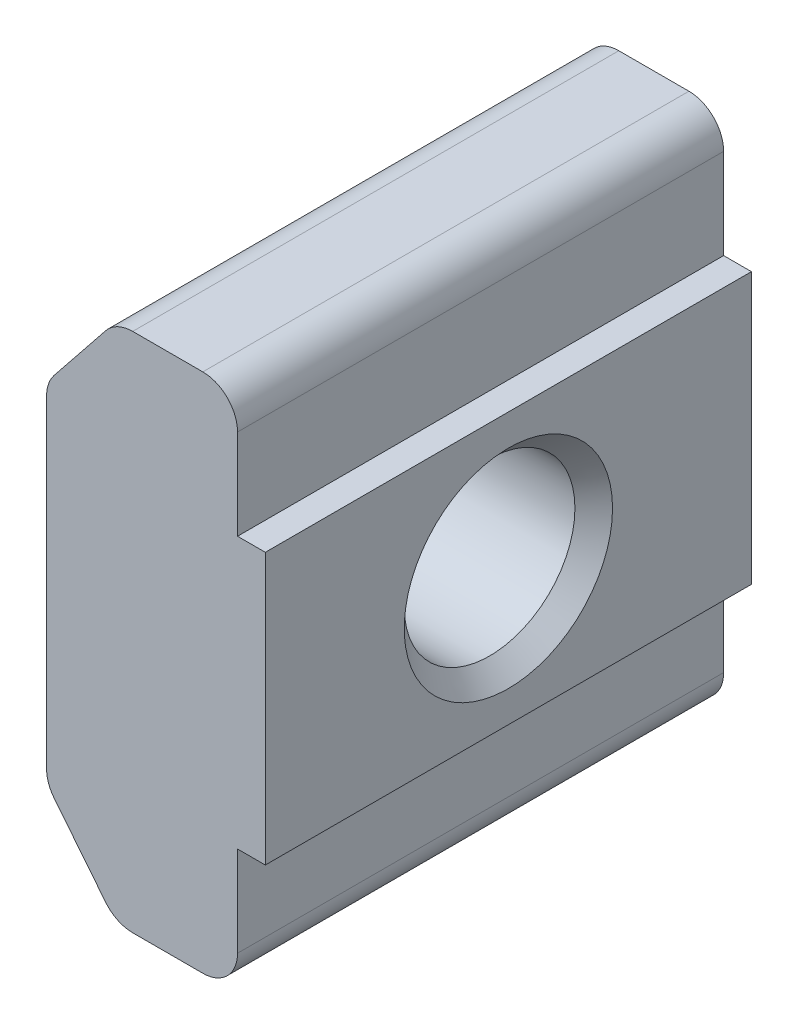
ISO-10303-21;
HEADER;
FILE_DESCRIPTION(('STEP AP214'),'2;1');
FILE_NAME('part.step','',(''),(''),'','','');
FILE_SCHEMA(('AUTOMOTIVE_DESIGN { 1 0 10303 214 1 1 1 1 }'));
ENDSEC;
DATA;
#1=APPLICATION_CONTEXT('core data for automotive mechanical design processes');
#2=APPLICATION_PROTOCOL_DEFINITION('international standard','automotive_design',2000,#1);
#3=PRODUCT_CONTEXT('',#1,'mechanical');
#4=PRODUCT('Part','Part','',(#3));
#5=PRODUCT_RELATED_PRODUCT_CATEGORY('part','',(#4));
#6=PRODUCT_DEFINITION_FORMATION('','',#4);
#7=PRODUCT_DEFINITION_CONTEXT('part definition',#1,'design');
#8=PRODUCT_DEFINITION('design','',#6,#7);
#9=PRODUCT_DEFINITION_SHAPE('','',#8);
#10=(LENGTH_UNIT() NAMED_UNIT(*) SI_UNIT(.MILLI.,.METRE.));
#11=(NAMED_UNIT(*) PLANE_ANGLE_UNIT() SI_UNIT($,.RADIAN.));
#12=(NAMED_UNIT(*) SI_UNIT($,.STERADIAN.) SOLID_ANGLE_UNIT());
#13=UNCERTAINTY_MEASURE_WITH_UNIT(LENGTH_MEASURE(1.E-05),#10,'distance_accuracy_value','');
#14=(GEOMETRIC_REPRESENTATION_CONTEXT(3) GLOBAL_UNCERTAINTY_ASSIGNED_CONTEXT((#13)) GLOBAL_UNIT_ASSIGNED_CONTEXT((#10,
#11,#12)) REPRESENTATION_CONTEXT('',''));
#15=CARTESIAN_POINT('',(0.,0.,0.));
#16=DIRECTION('',(0.,0.,1.));
#17=DIRECTION('',(1.,0.,0.));
#18=AXIS2_PLACEMENT_3D('',#15,#16,#17);
#19=CARTESIAN_POINT('',(-6.3,4.64921894064179,7.));
#20=DIRECTION('',(1.,0.,0.));
#21=DIRECTION('',(0.,0.,-1.));
#22=AXIS2_PLACEMENT_3D('',#19,#20,#21);
#23=PLANE('',#22);
#24=CARTESIAN_POINT('',(-6.3,0.,0.));
#25=DIRECTION('',(1.,0.,0.));
#26=DIRECTION('',(0.,0.,-1.));
#27=AXIS2_PLACEMENT_3D('',#24,#25,#26);
#28=CIRCLE('',#27,3.);
#29=CARTESIAN_POINT('',(-6.3,0.,-3.));
#30=VERTEX_POINT('',#29);
#31=EDGE_CURVE('E164',#30,#30,#28,.T.);
#32=ORIENTED_EDGE('',*,*,#31,.T.);
#33=EDGE_LOOP('',(#32));
#34=FACE_BOUND('',#33,.T.);
#35=DIRECTION('',(0.,-1.,0.));
#36=VECTOR('',#35,1.);
#37=CARTESIAN_POINT('',(-6.3,4.64921894064179,-7.));
#38=LINE('',#37,#36);
#39=CARTESIAN_POINT('',(-6.3,4.64921894064179,-7.));
#40=VERTEX_POINT('',#39);
#41=CARTESIAN_POINT('',(-6.3,-4.64921894064179,-7.));
#42=VERTEX_POINT('',#41);
#43=EDGE_CURVE('E160',#40,#42,#38,.T.);
#44=ORIENTED_EDGE('',*,*,#43,.T.);
#45=DIRECTION('',(0.,0.,-1.));
#46=VECTOR('',#45,1.);
#47=CARTESIAN_POINT('',(-6.3,-4.64921894064179,7.));
#48=LINE('',#47,#46);
#49=CARTESIAN_POINT('',(-6.3,-4.64921894064179,7.));
#50=VERTEX_POINT('',#49);
#51=EDGE_CURVE('E11',#50,#42,#48,.T.);
#52=ORIENTED_EDGE('',*,*,#51,.F.);
#53=DIRECTION('',(0.,-1.,0.));
#54=VECTOR('',#53,1.);
#55=CARTESIAN_POINT('',(-6.3,4.64921894064179,7.));
#56=LINE('',#55,#54);
#57=CARTESIAN_POINT('',(-6.3,4.64921894064179,7.));
#58=VERTEX_POINT('',#57);
#59=EDGE_CURVE('E191',#58,#50,#56,.T.);
#60=ORIENTED_EDGE('',*,*,#59,.F.);
#61=DIRECTION('',(0.,0.,-1.));
#62=VECTOR('',#61,1.);
#63=CARTESIAN_POINT('',(-6.3,4.64921894064179,7.));
#64=LINE('',#63,#62);
#65=EDGE_CURVE('E156',#58,#40,#64,.T.);
#66=ORIENTED_EDGE('',*,*,#65,.T.);
#67=EDGE_LOOP('',(#44,#52,#60,#66));
#68=FACE_BOUND('',#67,.T.);
#69=ADVANCED_FACE('F16',(#34,#68),#23,.F.);
#70=CARTESIAN_POINT('',(-5.3,-4.64921894064179,7.));
#71=DIRECTION('',(0.,0.,-1.));
#72=DIRECTION('',(-1.,0.,0.));
#73=AXIS2_PLACEMENT_3D('',#70,#71,#72);
#74=CYLINDRICAL_SURFACE('',#73,0.999999999999996);
#75=CARTESIAN_POINT('',(-5.3,-4.64921894064179,-7.));
#76=DIRECTION('',(0.,0.,1.));
#77=DIRECTION('',(1.,0.,0.));
#78=AXIS2_PLACEMENT_3D('',#75,#76,#77);
#79=CIRCLE('',#78,0.999999999999996);
#80=CARTESIAN_POINT('',(-6.08086880944303,-5.27391398819621,-7.));
#81=VERTEX_POINT('',#80);
#82=EDGE_CURVE('E163',#42,#81,#79,.T.);
#83=ORIENTED_EDGE('',*,*,#82,.T.);
#84=DIRECTION('',(0.,0.,-1.));
#85=VECTOR('',#84,1.);
#86=CARTESIAN_POINT('',(-6.08086880944303,-5.27391398819621,7.));
#87=LINE('',#86,#85);
#88=CARTESIAN_POINT('',(-6.08086880944303,-5.27391398819621,7.));
#89=VERTEX_POINT('',#88);
#90=EDGE_CURVE('E24',#89,#81,#87,.T.);
#91=ORIENTED_EDGE('',*,*,#90,.F.);
#92=CARTESIAN_POINT('',(-5.3,-4.64921894064179,7.));
#93=DIRECTION('',(0.,0.,1.));
#94=DIRECTION('',(1.,0.,0.));
#95=AXIS2_PLACEMENT_3D('',#92,#93,#94);
#96=CIRCLE('',#95,0.999999999999996);
#97=EDGE_CURVE('E99',#50,#89,#96,.T.);
#98=ORIENTED_EDGE('',*,*,#97,.F.);
#99=ORIENTED_EDGE('',*,*,#51,.T.);
#100=EDGE_LOOP('',(#83,#91,#98,#99));
#101=FACE_BOUND('',#100,.T.);
#102=ADVANCED_FACE('F290',(#101),#74,.T.);
#103=CARTESIAN_POINT('',(-6.08086880944303,-5.27391398819621,7.));
#104=DIRECTION('',(0.78086880944303,0.624695047554424,0.));
#105=DIRECTION('',(-0.624695047554424,0.78086880944303,0.));
#106=AXIS2_PLACEMENT_3D('',#103,#104,#105);
#107=PLANE('',#106);
#108=DIRECTION('',(0.624695047554424,-0.78086880944303,0.));
#109=VECTOR('',#108,1.);
#110=CARTESIAN_POINT('',(-6.08086880944303,-5.27391398819621,-7.));
#111=LINE('',#110,#109);
#112=CARTESIAN_POINT('',(-4.60024396195646,-7.12469504755442,-7.));
#113=VERTEX_POINT('',#112);
#114=EDGE_CURVE('E166',#81,#113,#111,.T.);
#115=ORIENTED_EDGE('',*,*,#114,.T.);
#116=DIRECTION('',(0.,0.,-1.));
#117=VECTOR('',#116,1.);
#118=CARTESIAN_POINT('',(-4.60024396195646,-7.12469504755442,7.));
#119=LINE('',#118,#117);
#120=CARTESIAN_POINT('',(-4.60024396195646,-7.12469504755442,7.));
#121=VERTEX_POINT('',#120);
#122=EDGE_CURVE('E222',#121,#113,#119,.T.);
#123=ORIENTED_EDGE('',*,*,#122,.F.);
#124=DIRECTION('',(0.624695047554424,-0.78086880944303,0.));
#125=VECTOR('',#124,1.);
#126=CARTESIAN_POINT('',(-6.08086880944303,-5.27391398819621,7.));
#127=LINE('',#126,#125);
#128=EDGE_CURVE('E230',#89,#121,#127,.T.);
#129=ORIENTED_EDGE('',*,*,#128,.F.);
#130=ORIENTED_EDGE('',*,*,#90,.T.);
#131=EDGE_LOOP('',(#115,#123,#129,#130));
#132=FACE_BOUND('',#131,.T.);
#133=ADVANCED_FACE('F228',(#132),#107,.F.);
#134=CARTESIAN_POINT('',(-3.81937515251344,-6.50000000000001,7.));
#135=DIRECTION('',(0.,0.,-1.));
#136=DIRECTION('',(-1.,0.,0.));
#137=AXIS2_PLACEMENT_3D('',#134,#135,#136);
#138=CYLINDRICAL_SURFACE('',#137,0.999999999999987);
#139=CARTESIAN_POINT('',(-3.81937515251344,-6.50000000000001,-7.));
#140=DIRECTION('',(0.,0.,1.));
#141=DIRECTION('',(1.,0.,0.));
#142=AXIS2_PLACEMENT_3D('',#139,#140,#141);
#143=CIRCLE('',#142,0.999999999999987);
#144=CARTESIAN_POINT('',(-3.81937515251343,-7.5,-7.));
#145=VERTEX_POINT('',#144);
#146=EDGE_CURVE('E168',#113,#145,#143,.T.);
#147=ORIENTED_EDGE('',*,*,#146,.T.);
#148=DIRECTION('',(0.,0.,-1.));
#149=VECTOR('',#148,1.);
#150=CARTESIAN_POINT('',(-3.81937515251343,-7.5,7.));
#151=LINE('',#150,#149);
#152=CARTESIAN_POINT('',(-3.81937515251343,-7.5,7.));
#153=VERTEX_POINT('',#152);
#154=EDGE_CURVE('E219',#153,#145,#151,.T.);
#155=ORIENTED_EDGE('',*,*,#154,.F.);
#156=CARTESIAN_POINT('',(-3.81937515251344,-6.50000000000001,7.));
#157=DIRECTION('',(0.,0.,1.));
#158=DIRECTION('',(1.,0.,0.));
#159=AXIS2_PLACEMENT_3D('',#156,#157,#158);
#160=CIRCLE('',#159,0.999999999999987);
#161=EDGE_CURVE('E248',#121,#153,#160,.T.);
#162=ORIENTED_EDGE('',*,*,#161,.F.);
#163=ORIENTED_EDGE('',*,*,#122,.T.);
#164=EDGE_LOOP('',(#147,#155,#162,#163));
#165=FACE_BOUND('',#164,.T.);
#166=ADVANCED_FACE('F239',(#165),#138,.T.);
#167=CARTESIAN_POINT('',(-3.81937515251343,-7.5,7.));
#168=DIRECTION('',(0.,1.,0.));
#169=DIRECTION('',(0.,0.,1.));
#170=AXIS2_PLACEMENT_3D('',#167,#168,#169);
#171=PLANE('',#170);
#172=DIRECTION('',(1.,0.,0.));
#173=VECTOR('',#172,1.);
#174=CARTESIAN_POINT('',(-3.81937515251343,-7.5,-7.));
#175=LINE('',#174,#173);
#176=CARTESIAN_POINT('',(-1.8,-7.5,-7.));
#177=VERTEX_POINT('',#176);
#178=EDGE_CURVE('E170',#145,#177,#175,.T.);
#179=ORIENTED_EDGE('',*,*,#178,.T.);
#180=DIRECTION('',(0.,0.,-1.));
#181=VECTOR('',#180,1.);
#182=CARTESIAN_POINT('',(-1.8,-7.5,7.));
#183=LINE('',#182,#181);
#184=CARTESIAN_POINT('',(-1.8,-7.5,7.));
#185=VERTEX_POINT('',#184);
#186=EDGE_CURVE('E216',#185,#177,#183,.T.);
#187=ORIENTED_EDGE('',*,*,#186,.F.);
#188=DIRECTION('',(1.,0.,0.));
#189=VECTOR('',#188,1.);
#190=CARTESIAN_POINT('',(-3.81937515251343,-7.5,7.));
#191=LINE('',#190,#189);
#192=EDGE_CURVE('E245',#153,#185,#191,.T.);
#193=ORIENTED_EDGE('',*,*,#192,.F.);
#194=ORIENTED_EDGE('',*,*,#154,.T.);
#195=EDGE_LOOP('',(#179,#187,#193,#194));
#196=FACE_BOUND('',#195,.T.);
#197=ADVANCED_FACE('F243',(#196),#171,.F.);
#198=CARTESIAN_POINT('',(-1.8,-6.5,7.));
#199=DIRECTION('',(0.,0.,-1.));
#200=DIRECTION('',(-1.,0.,0.));
#201=AXIS2_PLACEMENT_3D('',#198,#199,#200);
#202=CYLINDRICAL_SURFACE('',#201,0.999999999999997);
#203=CARTESIAN_POINT('',(-1.8,-6.5,-7.));
#204=DIRECTION('',(0.,0.,1.));
#205=DIRECTION('',(1.,0.,0.));
#206=AXIS2_PLACEMENT_3D('',#203,#204,#205);
#207=CIRCLE('',#206,0.999999999999997);
#208=CARTESIAN_POINT('',(-0.8,-6.5,-7.));
#209=VERTEX_POINT('',#208);
#210=EDGE_CURVE('E172',#177,#209,#207,.T.);
#211=ORIENTED_EDGE('',*,*,#210,.T.);
#212=DIRECTION('',(0.,0.,-1.));
#213=VECTOR('',#212,1.);
#214=CARTESIAN_POINT('',(-0.8,-6.5,7.));
#215=LINE('',#214,#213);
#216=CARTESIAN_POINT('',(-0.8,-6.5,7.));
#217=VERTEX_POINT('',#216);
#218=EDGE_CURVE('E213',#217,#209,#215,.T.);
#219=ORIENTED_EDGE('',*,*,#218,.F.);
#220=CARTESIAN_POINT('',(-1.8,-6.5,7.));
#221=DIRECTION('',(0.,0.,1.));
#222=DIRECTION('',(1.,0.,0.));
#223=AXIS2_PLACEMENT_3D('',#220,#221,#222);
#224=CIRCLE('',#223,0.999999999999997);
#225=EDGE_CURVE('E247',#185,#217,#224,.T.);
#226=ORIENTED_EDGE('',*,*,#225,.F.);
#227=ORIENTED_EDGE('',*,*,#186,.T.);
#228=EDGE_LOOP('',(#211,#219,#226,#227));
#229=FACE_BOUND('',#228,.T.);
#230=ADVANCED_FACE('F349',(#229),#202,.T.);
#231=CARTESIAN_POINT('',(-0.8,-6.5,7.));
#232=DIRECTION('',(-1.,0.,0.));
#233=DIRECTION('',(0.,0.,1.));
#234=AXIS2_PLACEMENT_3D('',#231,#232,#233);
#235=PLANE('',#234);
#236=DIRECTION('',(0.,1.,0.));
#237=VECTOR('',#236,1.);
#238=CARTESIAN_POINT('',(-0.8,-6.5,-7.));
#239=LINE('',#238,#237);
#240=CARTESIAN_POINT('',(-0.8,-3.9,-7.));
#241=VERTEX_POINT('',#240);
#242=EDGE_CURVE('E174',#209,#241,#239,.T.);
#243=ORIENTED_EDGE('',*,*,#242,.T.);
#244=DIRECTION('',(0.,0.,-1.));
#245=VECTOR('',#244,1.);
#246=CARTESIAN_POINT('',(-0.8,-3.9,7.));
#247=LINE('',#246,#245);
#248=CARTESIAN_POINT('',(-0.8,-3.9,7.));
#249=VERTEX_POINT('',#248);
#250=EDGE_CURVE('E210',#249,#241,#247,.T.);
#251=ORIENTED_EDGE('',*,*,#250,.F.);
#252=DIRECTION('',(0.,1.,0.));
#253=VECTOR('',#252,1.);
#254=CARTESIAN_POINT('',(-0.8,-6.5,7.));
#255=LINE('',#254,#253);
#256=EDGE_CURVE('E250',#217,#249,#255,.T.);
#257=ORIENTED_EDGE('',*,*,#256,.F.);
#258=ORIENTED_EDGE('',*,*,#218,.T.);
#259=EDGE_LOOP('',(#243,#251,#257,#258));
#260=FACE_BOUND('',#259,.T.);
#261=ADVANCED_FACE('F345',(#260),#235,.F.);
#262=CARTESIAN_POINT('',(-0.8,-3.9,7.));
#263=DIRECTION('',(0.,1.,0.));
#264=DIRECTION('',(-1.,0.,0.));
#265=AXIS2_PLACEMENT_3D('',#262,#263,#264);
#266=PLANE('',#265);
#267=DIRECTION('',(1.,0.,0.));
#268=VECTOR('',#267,1.);
#269=CARTESIAN_POINT('',(-0.8,-3.9,-7.));
#270=LINE('',#269,#268);
#271=CARTESIAN_POINT('',(0.,-3.9,-7.));
#272=VERTEX_POINT('',#271);
#273=EDGE_CURVE('E176',#241,#272,#270,.T.);
#274=ORIENTED_EDGE('',*,*,#273,.T.);
#275=DIRECTION('',(0.,0.,-1.));
#276=VECTOR('',#275,1.);
#277=CARTESIAN_POINT('',(0.,-3.9,7.));
#278=LINE('',#277,#276);
#279=CARTESIAN_POINT('',(0.,-3.9,7.));
#280=VERTEX_POINT('',#279);
#281=EDGE_CURVE('E207',#280,#272,#278,.T.);
#282=ORIENTED_EDGE('',*,*,#281,.F.);
#283=DIRECTION('',(1.,0.,0.));
#284=VECTOR('',#283,1.);
#285=CARTESIAN_POINT('',(-0.8,-3.9,7.));
#286=LINE('',#285,#284);
#287=EDGE_CURVE('E256',#249,#280,#286,.T.);
#288=ORIENTED_EDGE('',*,*,#287,.F.);
#289=ORIENTED_EDGE('',*,*,#250,.T.);
#290=EDGE_LOOP('',(#274,#282,#288,#289));
#291=FACE_BOUND('',#290,.T.);
#292=ADVANCED_FACE('F319',(#291),#266,.F.);
#293=CARTESIAN_POINT('',(0.,-3.9,7.));
#294=DIRECTION('',(-1.,0.,0.));
#295=DIRECTION('',(0.,0.,1.));
#296=AXIS2_PLACEMENT_3D('',#293,#294,#295);
#297=PLANE('',#296);
#298=CARTESIAN_POINT('',(0.,0.,0.));
#299=DIRECTION('',(1.,0.,0.));
#300=DIRECTION('',(0.,0.,-1.));
#301=AXIS2_PLACEMENT_3D('',#298,#299,#300);
#302=CIRCLE('',#301,3.);
#303=CARTESIAN_POINT('',(0.,0.,-3.));
#304=VERTEX_POINT('',#303);
#305=EDGE_CURVE('E308',#304,#304,#302,.T.);
#306=ORIENTED_EDGE('',*,*,#305,.F.);
#307=EDGE_LOOP('',(#306));
#308=FACE_BOUND('',#307,.T.);
#309=DIRECTION('',(0.,1.,0.));
#310=VECTOR('',#309,1.);
#311=CARTESIAN_POINT('',(0.,-3.9,-7.));
#312=LINE('',#311,#310);
#313=CARTESIAN_POINT('',(0.,3.9,-7.));
#314=VERTEX_POINT('',#313);
#315=EDGE_CURVE('E178',#272,#314,#312,.T.);
#316=ORIENTED_EDGE('',*,*,#315,.T.);
#317=DIRECTION('',(0.,0.,-1.));
#318=VECTOR('',#317,1.);
#319=CARTESIAN_POINT('',(0.,3.9,7.));
#320=LINE('',#319,#318);
#321=CARTESIAN_POINT('',(0.,3.9,7.));
#322=VERTEX_POINT('',#321);
#323=EDGE_CURVE('E204',#322,#314,#320,.T.);
#324=ORIENTED_EDGE('',*,*,#323,.F.);
#325=DIRECTION('',(0.,1.,0.));
#326=VECTOR('',#325,1.);
#327=CARTESIAN_POINT('',(0.,-3.9,7.));
#328=LINE('',#327,#326);
#329=EDGE_CURVE('E258',#280,#322,#328,.T.);
#330=ORIENTED_EDGE('',*,*,#329,.F.);
#331=ORIENTED_EDGE('',*,*,#281,.T.);
#332=EDGE_LOOP('',(#316,#324,#330,#331));
#333=FACE_BOUND('',#332,.T.);
#334=ADVANCED_FACE('F315',(#308,#333),#297,.F.);
#335=CARTESIAN_POINT('',(0.,3.9,7.));
#336=DIRECTION('',(0.,-1.,0.));
#337=DIRECTION('',(1.,0.,0.));
#338=AXIS2_PLACEMENT_3D('',#335,#336,#337);
#339=PLANE('',#338);
#340=DIRECTION('',(-1.,0.,0.));
#341=VECTOR('',#340,1.);
#342=CARTESIAN_POINT('',(0.,3.9,-7.));
#343=LINE('',#342,#341);
#344=CARTESIAN_POINT('',(-0.8,3.9,-7.));
#345=VERTEX_POINT('',#344);
#346=EDGE_CURVE('E180',#314,#345,#343,.T.);
#347=ORIENTED_EDGE('',*,*,#346,.T.);
#348=DIRECTION('',(0.,0.,-1.));
#349=VECTOR('',#348,1.);
#350=CARTESIAN_POINT('',(-0.8,3.9,7.));
#351=LINE('',#350,#349);
#352=CARTESIAN_POINT('',(-0.8,3.9,7.));
#353=VERTEX_POINT('',#352);
#354=EDGE_CURVE('E201',#353,#345,#351,.T.);
#355=ORIENTED_EDGE('',*,*,#354,.F.);
#356=DIRECTION('',(-1.,0.,0.));
#357=VECTOR('',#356,1.);
#358=CARTESIAN_POINT('',(0.,3.9,7.));
#359=LINE('',#358,#357);
#360=EDGE_CURVE('E260',#322,#353,#359,.T.);
#361=ORIENTED_EDGE('',*,*,#360,.F.);
#362=ORIENTED_EDGE('',*,*,#323,.T.);
#363=EDGE_LOOP('',(#347,#355,#361,#362));
#364=FACE_BOUND('',#363,.T.);
#365=ADVANCED_FACE('F318',(#364),#339,.F.);
#366=CARTESIAN_POINT('',(-0.8,3.9,7.));
#367=DIRECTION('',(-1.,0.,0.));
#368=DIRECTION('',(0.,0.,1.));
#369=AXIS2_PLACEMENT_3D('',#366,#367,#368);
#370=PLANE('',#369);
#371=DIRECTION('',(0.,1.,0.));
#372=VECTOR('',#371,1.);
#373=CARTESIAN_POINT('',(-0.8,3.9,-7.));
#374=LINE('',#373,#372);
#375=CARTESIAN_POINT('',(-0.8,6.5,-7.));
#376=VERTEX_POINT('',#375);
#377=EDGE_CURVE('E182',#345,#376,#374,.T.);
#378=ORIENTED_EDGE('',*,*,#377,.T.);
#379=DIRECTION('',(0.,0.,-1.));
#380=VECTOR('',#379,1.);
#381=CARTESIAN_POINT('',(-0.8,6.5,7.));
#382=LINE('',#381,#380);
#383=CARTESIAN_POINT('',(-0.8,6.5,7.));
#384=VERTEX_POINT('',#383);
#385=EDGE_CURVE('E198',#384,#376,#382,.T.);
#386=ORIENTED_EDGE('',*,*,#385,.F.);
#387=DIRECTION('',(0.,1.,0.));
#388=VECTOR('',#387,1.);
#389=CARTESIAN_POINT('',(-0.8,3.9,7.));
#390=LINE('',#389,#388);
#391=EDGE_CURVE('E262',#353,#384,#390,.T.);
#392=ORIENTED_EDGE('',*,*,#391,.F.);
#393=ORIENTED_EDGE('',*,*,#354,.T.);
#394=EDGE_LOOP('',(#378,#386,#392,#393));
#395=FACE_BOUND('',#394,.T.);
#396=ADVANCED_FACE('F332',(#395),#370,.F.);
#397=CARTESIAN_POINT('',(-1.8,6.5,7.));
#398=DIRECTION('',(0.,0.,-1.));
#399=DIRECTION('',(-1.,0.,0.));
#400=AXIS2_PLACEMENT_3D('',#397,#398,#399);
#401=CYLINDRICAL_SURFACE('',#400,1.);
#402=CARTESIAN_POINT('',(-1.8,6.5,-7.));
#403=DIRECTION('',(0.,0.,1.));
#404=DIRECTION('',(1.,0.,0.));
#405=AXIS2_PLACEMENT_3D('',#402,#403,#404);
#406=CIRCLE('',#405,1.);
#407=CARTESIAN_POINT('',(-1.8,7.5,-7.));
#408=VERTEX_POINT('',#407);
#409=EDGE_CURVE('E184',#376,#408,#406,.T.);
#410=ORIENTED_EDGE('',*,*,#409,.T.);
#411=DIRECTION('',(0.,0.,-1.));
#412=VECTOR('',#411,1.);
#413=CARTESIAN_POINT('',(-1.8,7.5,7.));
#414=LINE('',#413,#412);
#415=CARTESIAN_POINT('',(-1.8,7.5,7.));
#416=VERTEX_POINT('',#415);
#417=EDGE_CURVE('E195',#416,#408,#414,.T.);
#418=ORIENTED_EDGE('',*,*,#417,.F.);
#419=CARTESIAN_POINT('',(-1.8,6.5,7.));
#420=DIRECTION('',(0.,0.,1.));
#421=DIRECTION('',(1.,0.,0.));
#422=AXIS2_PLACEMENT_3D('',#419,#420,#421);
#423=CIRCLE('',#422,1.);
#424=EDGE_CURVE('E264',#384,#416,#423,.T.);
#425=ORIENTED_EDGE('',*,*,#424,.F.);
#426=ORIENTED_EDGE('',*,*,#385,.T.);
#427=EDGE_LOOP('',(#410,#418,#425,#426));
#428=FACE_BOUND('',#427,.T.);
#429=ADVANCED_FACE('F270',(#428),#401,.T.);
#430=CARTESIAN_POINT('',(-1.8,7.5,7.));
#431=DIRECTION('',(0.,-1.,0.));
#432=DIRECTION('',(0.,0.,-1.));
#433=AXIS2_PLACEMENT_3D('',#430,#431,#432);
#434=PLANE('',#433);
#435=DIRECTION('',(-1.,0.,0.));
#436=VECTOR('',#435,1.);
#437=CARTESIAN_POINT('',(-1.8,7.5,-7.));
#438=LINE('',#437,#436);
#439=CARTESIAN_POINT('',(-3.81937515251343,7.5,-7.));
#440=VERTEX_POINT('',#439);
#441=EDGE_CURVE('E186',#408,#440,#438,.T.);
#442=ORIENTED_EDGE('',*,*,#441,.T.);
#443=DIRECTION('',(0.,0.,-1.));
#444=VECTOR('',#443,1.);
#445=CARTESIAN_POINT('',(-3.81937515251343,7.5,7.));
#446=LINE('',#445,#444);
#447=CARTESIAN_POINT('',(-3.81937515251343,7.5,7.));
#448=VERTEX_POINT('',#447);
#449=EDGE_CURVE('E151',#448,#440,#446,.T.);
#450=ORIENTED_EDGE('',*,*,#449,.F.);
#451=DIRECTION('',(-1.,0.,0.));
#452=VECTOR('',#451,1.);
#453=CARTESIAN_POINT('',(-1.8,7.5,7.));
#454=LINE('',#453,#452);
#455=EDGE_CURVE('E142',#416,#448,#454,.T.);
#456=ORIENTED_EDGE('',*,*,#455,.F.);
#457=ORIENTED_EDGE('',*,*,#417,.T.);
#458=EDGE_LOOP('',(#442,#450,#456,#457));
#459=FACE_BOUND('',#458,.T.);
#460=ADVANCED_FACE('F274',(#459),#434,.F.);
#461=CARTESIAN_POINT('',(-3.81937515251344,6.50000000000001,7.));
#462=DIRECTION('',(0.,0.,-1.));
#463=DIRECTION('',(-1.,0.,0.));
#464=AXIS2_PLACEMENT_3D('',#461,#462,#463);
#465=CYLINDRICAL_SURFACE('',#464,0.999999999999985);
#466=CARTESIAN_POINT('',(-3.81937515251344,6.50000000000001,-7.));
#467=DIRECTION('',(0.,0.,1.));
#468=DIRECTION('',(1.,0.,0.));
#469=AXIS2_PLACEMENT_3D('',#466,#467,#468);
#470=CIRCLE('',#469,0.999999999999985);
#471=CARTESIAN_POINT('',(-4.60024396195646,7.12469504755442,-7.));
#472=VERTEX_POINT('',#471);
#473=EDGE_CURVE('E150',#440,#472,#470,.T.);
#474=ORIENTED_EDGE('',*,*,#473,.T.);
#475=DIRECTION('',(0.,0.,-1.));
#476=VECTOR('',#475,1.);
#477=CARTESIAN_POINT('',(-4.60024396195646,7.12469504755442,7.));
#478=LINE('',#477,#476);
#479=CARTESIAN_POINT('',(-4.60024396195646,7.12469504755442,7.));
#480=VERTEX_POINT('',#479);
#481=EDGE_CURVE('E147',#480,#472,#478,.T.);
#482=ORIENTED_EDGE('',*,*,#481,.F.);
#483=CARTESIAN_POINT('',(-3.81937515251344,6.50000000000001,7.));
#484=DIRECTION('',(0.,0.,1.));
#485=DIRECTION('',(1.,0.,0.));
#486=AXIS2_PLACEMENT_3D('',#483,#484,#485);
#487=CIRCLE('',#486,0.999999999999985);
#488=EDGE_CURVE('E136',#448,#480,#487,.T.);
#489=ORIENTED_EDGE('',*,*,#488,.F.);
#490=ORIENTED_EDGE('',*,*,#449,.T.);
#491=EDGE_LOOP('',(#474,#482,#489,#490));
#492=FACE_BOUND('',#491,.T.);
#493=ADVANCED_FACE('F148',(#492),#465,.T.);
#494=CARTESIAN_POINT('',(-4.60024396195646,7.12469504755442,7.));
#495=DIRECTION('',(0.78086880944303,-0.624695047554424,0.));
#496=DIRECTION('',(0.624695047554424,0.78086880944303,0.));
#497=AXIS2_PLACEMENT_3D('',#494,#495,#496);
#498=PLANE('',#497);
#499=DIRECTION('',(-0.624695047554424,-0.78086880944303,0.));
#500=VECTOR('',#499,1.);
#501=CARTESIAN_POINT('',(-4.60024396195646,7.12469504755442,-7.));
#502=LINE('',#501,#500);
#503=CARTESIAN_POINT('',(-6.08086880944303,5.27391398819621,-7.));
#504=VERTEX_POINT('',#503);
#505=EDGE_CURVE('E85',#472,#504,#502,.T.);
#506=ORIENTED_EDGE('',*,*,#505,.T.);
#507=DIRECTION('',(0.,0.,-1.));
#508=VECTOR('',#507,1.);
#509=CARTESIAN_POINT('',(-6.08086880944303,5.27391398819621,7.));
#510=LINE('',#509,#508);
#511=CARTESIAN_POINT('',(-6.08086880944303,5.27391398819621,7.));
#512=VERTEX_POINT('',#511);
#513=EDGE_CURVE('E152',#512,#504,#510,.T.);
#514=ORIENTED_EDGE('',*,*,#513,.F.);
#515=DIRECTION('',(-0.624695047554424,-0.78086880944303,0.));
#516=VECTOR('',#515,1.);
#517=CARTESIAN_POINT('',(-4.60024396195646,7.12469504755442,7.));
#518=LINE('',#517,#516);
#519=EDGE_CURVE('E140',#480,#512,#518,.T.);
#520=ORIENTED_EDGE('',*,*,#519,.F.);
#521=ORIENTED_EDGE('',*,*,#481,.T.);
#522=EDGE_LOOP('',(#506,#514,#520,#521));
#523=FACE_BOUND('',#522,.T.);
#524=ADVANCED_FACE('F154',(#523),#498,.F.);
#525=CARTESIAN_POINT('',(-5.30000000000002,4.64921894064179,7.));
#526=DIRECTION('',(0.,0.,-1.));
#527=DIRECTION('',(-1.,0.,0.));
#528=AXIS2_PLACEMENT_3D('',#525,#526,#527);
#529=CYLINDRICAL_SURFACE('',#528,0.999999999999984);
#530=CARTESIAN_POINT('',(-5.30000000000002,4.64921894064179,-7.));
#531=DIRECTION('',(0.,0.,1.));
#532=DIRECTION('',(1.,0.,0.));
#533=AXIS2_PLACEMENT_3D('',#530,#531,#532);
#534=CIRCLE('',#533,0.999999999999984);
#535=EDGE_CURVE('E91',#504,#40,#534,.T.);
#536=ORIENTED_EDGE('',*,*,#535,.T.);
#537=ORIENTED_EDGE('',*,*,#65,.F.);
#538=CARTESIAN_POINT('',(-5.30000000000002,4.64921894064179,7.));
#539=DIRECTION('',(0.,0.,1.));
#540=DIRECTION('',(1.,0.,0.));
#541=AXIS2_PLACEMENT_3D('',#538,#539,#540);
#542=CIRCLE('',#541,0.999999999999984);
#543=EDGE_CURVE('E32',#512,#58,#542,.T.);
#544=ORIENTED_EDGE('',*,*,#543,.F.);
#545=ORIENTED_EDGE('',*,*,#513,.T.);
#546=EDGE_LOOP('',(#536,#537,#544,#545));
#547=FACE_BOUND('',#546,.T.);
#548=ADVANCED_FACE('F278',(#547),#529,.T.);
#549=CARTESIAN_POINT('',(-5.3,-4.64921894064179,7.));
#550=DIRECTION('',(0.,0.,1.));
#551=DIRECTION('',(1.,0.,0.));
#552=AXIS2_PLACEMENT_3D('',#549,#550,#551);
#553=PLANE('',#552);
#554=ORIENTED_EDGE('',*,*,#59,.T.);
#555=ORIENTED_EDGE('',*,*,#97,.T.);
#556=ORIENTED_EDGE('',*,*,#128,.T.);
#557=ORIENTED_EDGE('',*,*,#161,.T.);
#558=ORIENTED_EDGE('',*,*,#192,.T.);
#559=ORIENTED_EDGE('',*,*,#225,.T.);
#560=ORIENTED_EDGE('',*,*,#256,.T.);
#561=ORIENTED_EDGE('',*,*,#287,.T.);
#562=ORIENTED_EDGE('',*,*,#329,.T.);
#563=ORIENTED_EDGE('',*,*,#360,.T.);
#564=ORIENTED_EDGE('',*,*,#391,.T.);
#565=ORIENTED_EDGE('',*,*,#424,.T.);
#566=ORIENTED_EDGE('',*,*,#455,.T.);
#567=ORIENTED_EDGE('',*,*,#488,.T.);
#568=ORIENTED_EDGE('',*,*,#519,.T.);
#569=ORIENTED_EDGE('',*,*,#543,.T.);
#570=EDGE_LOOP('',(#554,#555,#556,#557,#558,#559,#560,#561,#562,#563,#564,#565,#566,#567,#568,#569));
#571=FACE_BOUND('',#570,.T.);
#572=ADVANCED_FACE('F138',(#571),#553,.T.);
#573=CARTESIAN_POINT('',(-5.3,-4.64921894064179,-7.));
#574=DIRECTION('',(0.,0.,1.));
#575=DIRECTION('',(1.,0.,0.));
#576=AXIS2_PLACEMENT_3D('',#573,#574,#575);
#577=PLANE('',#576);
#578=ORIENTED_EDGE('',*,*,#43,.F.);
#579=ORIENTED_EDGE('',*,*,#535,.F.);
#580=ORIENTED_EDGE('',*,*,#505,.F.);
#581=ORIENTED_EDGE('',*,*,#473,.F.);
#582=ORIENTED_EDGE('',*,*,#441,.F.);
#583=ORIENTED_EDGE('',*,*,#409,.F.);
#584=ORIENTED_EDGE('',*,*,#377,.F.);
#585=ORIENTED_EDGE('',*,*,#346,.F.);
#586=ORIENTED_EDGE('',*,*,#315,.F.);
#587=ORIENTED_EDGE('',*,*,#273,.F.);
#588=ORIENTED_EDGE('',*,*,#242,.F.);
#589=ORIENTED_EDGE('',*,*,#210,.F.);
#590=ORIENTED_EDGE('',*,*,#178,.F.);
#591=ORIENTED_EDGE('',*,*,#146,.F.);
#592=ORIENTED_EDGE('',*,*,#114,.F.);
#593=ORIENTED_EDGE('',*,*,#82,.F.);
#594=EDGE_LOOP('',(#578,#579,#580,#581,#582,#583,#584,#585,#586,#587,#588,#589,#590,#591,#592,#593));
#595=FACE_BOUND('',#594,.T.);
#596=ADVANCED_FACE('F234',(#595),#577,.F.);
#597=CARTESIAN_POINT('',(-6.3,0.,0.));
#598=DIRECTION('',(-1.,0.,0.));
#599=DIRECTION('',(0.,0.,1.));
#600=AXIS2_PLACEMENT_3D('',#597,#598,#599);
#601=CONICAL_SURFACE('',#600,3.,0.785398163397448);
#602=CARTESIAN_POINT('',(-5.7585,0.,0.));
#603=DIRECTION('',(1.,0.,0.));
#604=DIRECTION('',(0.,0.,-1.));
#605=AXIS2_PLACEMENT_3D('',#602,#603,#604);
#606=CIRCLE('',#605,2.4585);
#607=CARTESIAN_POINT('',(-5.7585,0.,-2.4585));
#608=VERTEX_POINT('',#607);
#609=EDGE_CURVE('E298',#608,#608,#606,.T.);
#610=ORIENTED_EDGE('',*,*,#609,.T.);
#611=EDGE_LOOP('',(#610));
#612=FACE_BOUND('',#611,.T.);
#613=ORIENTED_EDGE('',*,*,#31,.F.);
#614=EDGE_LOOP('',(#613));
#615=FACE_BOUND('',#614,.T.);
#616=ADVANCED_FACE('F455',(#612,#615),#601,.F.);
#617=CARTESIAN_POINT('',(0.,0.,0.));
#618=DIRECTION('',(1.,0.,0.));
#619=DIRECTION('',(0.,0.,-1.));
#620=AXIS2_PLACEMENT_3D('',#617,#618,#619);
#621=CYLINDRICAL_SURFACE('',#620,2.4585);
#622=CARTESIAN_POINT('',(-0.541500000000001,0.,0.));
#623=DIRECTION('',(1.,0.,0.));
#624=DIRECTION('',(0.,0.,-1.));
#625=AXIS2_PLACEMENT_3D('',#622,#623,#624);
#626=CIRCLE('',#625,2.4585);
#627=CARTESIAN_POINT('',(-0.541500000000001,0.,-2.4585));
#628=VERTEX_POINT('',#627);
#629=EDGE_CURVE('E301',#628,#628,#626,.T.);
#630=ORIENTED_EDGE('',*,*,#629,.T.);
#631=EDGE_LOOP('',(#630));
#632=FACE_BOUND('',#631,.T.);
#633=ORIENTED_EDGE('',*,*,#609,.F.);
#634=EDGE_LOOP('',(#633));
#635=FACE_BOUND('',#634,.T.);
#636=ADVANCED_FACE('F463',(#632,#635),#621,.F.);
#637=CARTESIAN_POINT('',(-0.541500000000001,0.,0.));
#638=DIRECTION('',(1.,0.,0.));
#639=DIRECTION('',(0.,0.,-1.));
#640=AXIS2_PLACEMENT_3D('',#637,#638,#639);
#641=CONICAL_SURFACE('',#640,2.4585,0.785398163397447);
#642=ORIENTED_EDGE('',*,*,#305,.T.);
#643=EDGE_LOOP('',(#642));
#644=FACE_BOUND('',#643,.T.);
#645=ORIENTED_EDGE('',*,*,#629,.F.);
#646=EDGE_LOOP('',(#645));
#647=FACE_BOUND('',#646,.T.);
#648=ADVANCED_FACE('F312',(#644,#647),#641,.F.);
#649=CLOSED_SHELL('',(#69,#102,#133,#166,#197,#230,#261,#292,#334,#365,#396,#429,#460,#493,#524,
#548,#572,#596,#616,#636,#648));
#650=MANIFOLD_SOLID_BREP('B1',#649);
#651=ADVANCED_BREP_SHAPE_REPRESENTATION('',(#18,#650),#14);
#652=SHAPE_DEFINITION_REPRESENTATION(#9,#651);
ENDSEC;
END-ISO-10303-21;
